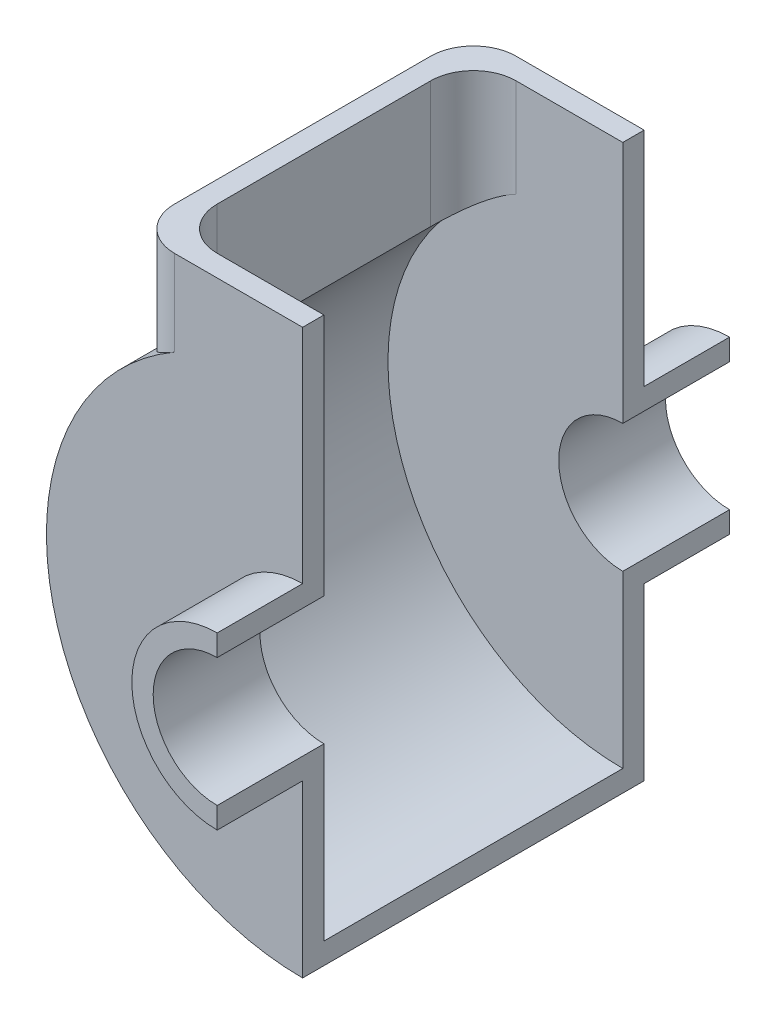
ISO-10303-21;
HEADER;
FILE_DESCRIPTION(('STEP AP214'),'2;1');
FILE_NAME('part.step','',(''),(''),'','','');
FILE_SCHEMA(('AUTOMOTIVE_DESIGN { 1 0 10303 214 1 1 1 1 }'));
ENDSEC;
DATA;
#1=APPLICATION_CONTEXT('core data for automotive mechanical design processes');
#2=APPLICATION_PROTOCOL_DEFINITION('international standard','automotive_design',2000,#1);
#3=PRODUCT_CONTEXT('',#1,'mechanical');
#4=PRODUCT('Part','Part','',(#3));
#5=PRODUCT_RELATED_PRODUCT_CATEGORY('part','',(#4));
#6=PRODUCT_DEFINITION_FORMATION('','',#4);
#7=PRODUCT_DEFINITION_CONTEXT('part definition',#1,'design');
#8=PRODUCT_DEFINITION('design','',#6,#7);
#9=PRODUCT_DEFINITION_SHAPE('','',#8);
#10=(LENGTH_UNIT() NAMED_UNIT(*) SI_UNIT(.MILLI.,.METRE.));
#11=(NAMED_UNIT(*) PLANE_ANGLE_UNIT() SI_UNIT($,.RADIAN.));
#12=(NAMED_UNIT(*) SI_UNIT($,.STERADIAN.) SOLID_ANGLE_UNIT());
#13=UNCERTAINTY_MEASURE_WITH_UNIT(LENGTH_MEASURE(1.E-05),#10,'distance_accuracy_value','');
#14=(GEOMETRIC_REPRESENTATION_CONTEXT(3) GLOBAL_UNCERTAINTY_ASSIGNED_CONTEXT((#13)) GLOBAL_UNIT_ASSIGNED_CONTEXT((#10,
#11,#12)) REPRESENTATION_CONTEXT('',''));
#15=CARTESIAN_POINT('',(0.,0.,0.));
#16=DIRECTION('',(0.,0.,1.));
#17=DIRECTION('',(1.,0.,0.));
#18=AXIS2_PLACEMENT_3D('',#15,#16,#17);
#19=CARTESIAN_POINT('',(0.,0.,25.));
#20=DIRECTION('',(0.,0.,-1.));
#21=DIRECTION('',(-1.,0.,0.));
#22=AXIS2_PLACEMENT_3D('',#19,#20,#21);
#23=CYLINDRICAL_SURFACE('',#22,20.);
#24=CARTESIAN_POINT('',(0.,0.,5.));
#25=DIRECTION('',(0.,0.,-1.));
#26=DIRECTION('',(-1.,0.,0.));
#27=AXIS2_PLACEMENT_3D('',#24,#25,#26);
#28=CIRCLE('',#27,20.);
#29=CARTESIAN_POINT('',(0.,-20.,5.));
#30=VERTEX_POINT('',#29);
#31=CARTESIAN_POINT('',(0.,20.,5.));
#32=VERTEX_POINT('',#31);
#33=EDGE_CURVE('E246',#30,#32,#28,.T.);
#34=ORIENTED_EDGE('',*,*,#33,.F.);
#35=DIRECTION('',(0.,0.,-1.));
#36=VECTOR('',#35,1.);
#37=CARTESIAN_POINT('',(0.,-20.,25.));
#38=LINE('',#37,#36);
#39=CARTESIAN_POINT('',(0.,-20.,25.));
#40=VERTEX_POINT('',#39);
#41=EDGE_CURVE('E291',#40,#30,#38,.T.);
#42=ORIENTED_EDGE('',*,*,#41,.F.);
#43=CARTESIAN_POINT('',(0.,0.,25.));
#44=DIRECTION('',(0.,0.,1.));
#45=DIRECTION('',(1.,0.,0.));
#46=AXIS2_PLACEMENT_3D('',#43,#44,#45);
#47=CIRCLE('',#46,20.);
#48=CARTESIAN_POINT('',(0.,20.,25.));
#49=VERTEX_POINT('',#48);
#50=EDGE_CURVE('E279',#49,#40,#47,.T.);
#51=ORIENTED_EDGE('',*,*,#50,.F.);
#52=DIRECTION('',(0.,0.,-1.));
#53=VECTOR('',#52,1.);
#54=CARTESIAN_POINT('',(0.,20.,25.));
#55=LINE('',#54,#53);
#56=EDGE_CURVE('E294',#49,#32,#55,.T.);
#57=ORIENTED_EDGE('',*,*,#56,.T.);
#58=EDGE_LOOP('',(#34,#42,#51,#57));
#59=FACE_BOUND('',#58,.T.);
#60=ADVANCED_FACE('F33',(#59),#23,.T.);
#61=CARTESIAN_POINT('',(0.,0.,25.));
#62=DIRECTION('',(0.,0.,-1.));
#63=DIRECTION('',(-1.,0.,0.));
#64=AXIS2_PLACEMENT_3D('',#61,#62,#63);
#65=CYLINDRICAL_SURFACE('',#64,15.);
#66=CARTESIAN_POINT('',(0.,0.,0.));
#67=DIRECTION('',(0.,0.,-1.));
#68=DIRECTION('',(-1.,0.,0.));
#69=AXIS2_PLACEMENT_3D('',#66,#67,#68);
#70=CIRCLE('',#69,15.);
#71=CARTESIAN_POINT('',(0.,-15.,0.));
#72=VERTEX_POINT('',#71);
#73=CARTESIAN_POINT('',(0.,15.,0.));
#74=VERTEX_POINT('',#73);
#75=EDGE_CURVE('E272',#72,#74,#70,.T.);
#76=ORIENTED_EDGE('',*,*,#75,.T.);
#77=DIRECTION('',(0.,0.,-1.));
#78=VECTOR('',#77,1.);
#79=CARTESIAN_POINT('',(0.,15.,25.));
#80=LINE('',#79,#78);
#81=CARTESIAN_POINT('',(0.,15.,25.));
#82=VERTEX_POINT('',#81);
#83=EDGE_CURVE('E296',#82,#74,#80,.T.);
#84=ORIENTED_EDGE('',*,*,#83,.F.);
#85=CARTESIAN_POINT('',(0.,0.,25.));
#86=DIRECTION('',(0.,0.,-1.));
#87=DIRECTION('',(-1.,0.,0.));
#88=AXIS2_PLACEMENT_3D('',#85,#86,#87);
#89=CIRCLE('',#88,15.);
#90=CARTESIAN_POINT('',(0.,-15.,25.));
#91=VERTEX_POINT('',#90);
#92=EDGE_CURVE('E273',#91,#82,#89,.T.);
#93=ORIENTED_EDGE('',*,*,#92,.F.);
#94=DIRECTION('',(0.,0.,-1.));
#95=VECTOR('',#94,1.);
#96=CARTESIAN_POINT('',(0.,-15.,25.));
#97=LINE('',#96,#95);
#98=EDGE_CURVE('E283',#91,#72,#97,.T.);
#99=ORIENTED_EDGE('',*,*,#98,.T.);
#100=EDGE_LOOP('',(#76,#84,#93,#99));
#101=FACE_BOUND('',#100,.T.);
#102=ADVANCED_FACE('F338',(#101),#65,.F.);
#103=CARTESIAN_POINT('',(0.,15.,25.));
#104=DIRECTION('',(-1.,0.,0.));
#105=DIRECTION('',(0.,0.,1.));
#106=AXIS2_PLACEMENT_3D('',#103,#104,#105);
#107=PLANE('',#106);
#108=DIRECTION('',(0.,1.,0.));
#109=VECTOR('',#108,1.);
#110=CARTESIAN_POINT('',(0.,15.,0.));
#111=LINE('',#110,#109);
#112=CARTESIAN_POINT('',(0.,72.,0.));
#113=VERTEX_POINT('',#112);
#114=EDGE_CURVE('E286',#74,#113,#111,.T.);
#115=ORIENTED_EDGE('',*,*,#114,.T.);
#116=DIRECTION('',(0.,0.,-1.));
#117=VECTOR('',#116,1.);
#118=CARTESIAN_POINT('',(0.,72.,5.));
#119=LINE('',#118,#117);
#120=CARTESIAN_POINT('',(0.,72.,5.));
#121=VERTEX_POINT('',#120);
#122=EDGE_CURVE('E269',#121,#113,#119,.T.);
#123=ORIENTED_EDGE('',*,*,#122,.F.);
#124=DIRECTION('',(0.,1.,0.));
#125=VECTOR('',#124,1.);
#126=CARTESIAN_POINT('',(0.,20.,5.));
#127=LINE('',#126,#125);
#128=EDGE_CURVE('E249',#32,#121,#127,.T.);
#129=ORIENTED_EDGE('',*,*,#128,.F.);
#130=ORIENTED_EDGE('',*,*,#56,.F.);
#131=DIRECTION('',(0.,1.,0.));
#132=VECTOR('',#131,1.);
#133=CARTESIAN_POINT('',(0.,15.,25.));
#134=LINE('',#133,#132);
#135=EDGE_CURVE('E276',#82,#49,#134,.T.);
#136=ORIENTED_EDGE('',*,*,#135,.F.);
#137=ORIENTED_EDGE('',*,*,#83,.T.);
#138=EDGE_LOOP('',(#115,#123,#129,#130,#136,#137));
#139=FACE_BOUND('',#138,.T.);
#140=ADVANCED_FACE('F383',(#139),#107,.F.);
#141=CARTESIAN_POINT('',(0.,-20.,25.));
#142=DIRECTION('',(-1.,0.,0.));
#143=DIRECTION('',(0.,0.,1.));
#144=AXIS2_PLACEMENT_3D('',#141,#142,#143);
#145=PLANE('',#144);
#146=DIRECTION('',(0.,0.,-1.));
#147=VECTOR('',#146,1.);
#148=CARTESIAN_POINT('',(0.,-60.,5.));
#149=LINE('',#148,#147);
#150=CARTESIAN_POINT('',(0.,-60.,5.));
#151=VERTEX_POINT('',#150);
#152=CARTESIAN_POINT('',(0.,-60.,-75.));
#153=VERTEX_POINT('',#152);
#154=EDGE_CURVE('E259',#151,#153,#149,.T.);
#155=ORIENTED_EDGE('',*,*,#154,.T.);
#156=DIRECTION('',(0.,1.,0.));
#157=VECTOR('',#156,1.);
#158=CARTESIAN_POINT('',(0.,-60.,-75.));
#159=LINE('',#158,#157);
#160=CARTESIAN_POINT('',(0.,-20.,-75.));
#161=VERTEX_POINT('',#160);
#162=EDGE_CURVE('E192',#153,#161,#159,.T.);
#163=ORIENTED_EDGE('',*,*,#162,.T.);
#164=DIRECTION('',(0.,0.,1.));
#165=VECTOR('',#164,1.);
#166=CARTESIAN_POINT('',(0.,-20.,-95.));
#167=LINE('',#166,#165);
#168=CARTESIAN_POINT('',(0.,-20.,-95.));
#169=VERTEX_POINT('',#168);
#170=EDGE_CURVE('E225',#169,#161,#167,.T.);
#171=ORIENTED_EDGE('',*,*,#170,.F.);
#172=DIRECTION('',(0.,1.,0.));
#173=VECTOR('',#172,1.);
#174=CARTESIAN_POINT('',(0.,-20.,-95.));
#175=LINE('',#174,#173);
#176=CARTESIAN_POINT('',(0.,-15.,-95.));
#177=VERTEX_POINT('',#176);
#178=EDGE_CURVE('E215',#169,#177,#175,.T.);
#179=ORIENTED_EDGE('',*,*,#178,.T.);
#180=DIRECTION('',(0.,0.,1.));
#181=VECTOR('',#180,1.);
#182=CARTESIAN_POINT('',(0.,-15.,-95.));
#183=LINE('',#182,#181);
#184=CARTESIAN_POINT('',(0.,-15.,-70.));
#185=VERTEX_POINT('',#184);
#186=EDGE_CURVE('E217',#177,#185,#183,.T.);
#187=ORIENTED_EDGE('',*,*,#186,.T.);
#188=DIRECTION('',(0.,1.,0.));
#189=VECTOR('',#188,1.);
#190=CARTESIAN_POINT('',(0.,-20.,-70.));
#191=LINE('',#190,#189);
#192=CARTESIAN_POINT('',(0.,-55.,-70.));
#193=VERTEX_POINT('',#192);
#194=EDGE_CURVE('E210',#193,#185,#191,.T.);
#195=ORIENTED_EDGE('',*,*,#194,.F.);
#196=DIRECTION('',(0.,0.,1.));
#197=VECTOR('',#196,1.);
#198=CARTESIAN_POINT('',(0.,-55.,-95.002));
#199=LINE('',#198,#197);
#200=CARTESIAN_POINT('',(0.,-55.,0.));
#201=VERTEX_POINT('',#200);
#202=EDGE_CURVE('E239',#193,#201,#199,.T.);
#203=ORIENTED_EDGE('',*,*,#202,.T.);
#204=DIRECTION('',(0.,1.,0.));
#205=VECTOR('',#204,1.);
#206=CARTESIAN_POINT('',(0.,-20.,0.));
#207=LINE('',#206,#205);
#208=EDGE_CURVE('E277',#201,#72,#207,.T.);
#209=ORIENTED_EDGE('',*,*,#208,.T.);
#210=ORIENTED_EDGE('',*,*,#98,.F.);
#211=DIRECTION('',(0.,1.,0.));
#212=VECTOR('',#211,1.);
#213=CARTESIAN_POINT('',(0.,-20.,25.));
#214=LINE('',#213,#212);
#215=EDGE_CURVE('E281',#40,#91,#214,.T.);
#216=ORIENTED_EDGE('',*,*,#215,.F.);
#217=ORIENTED_EDGE('',*,*,#41,.T.);
#218=DIRECTION('',(0.,1.,0.));
#219=VECTOR('',#218,1.);
#220=CARTESIAN_POINT('',(0.,-60.,5.));
#221=LINE('',#220,#219);
#222=EDGE_CURVE('E256',#151,#30,#221,.T.);
#223=ORIENTED_EDGE('',*,*,#222,.F.);
#224=EDGE_LOOP('',(#155,#163,#171,#179,#187,#195,#203,#209,#210,#216,#217,#223));
#225=FACE_BOUND('',#224,.T.);
#226=ADVANCED_FACE('F386',(#225),#145,.F.);
#227=CARTESIAN_POINT('',(0.,0.,25.));
#228=DIRECTION('',(0.,0.,-1.));
#229=DIRECTION('',(-1.,0.,0.));
#230=AXIS2_PLACEMENT_3D('',#227,#228,#229);
#231=PLANE('',#230);
#232=ORIENTED_EDGE('',*,*,#92,.T.);
#233=ORIENTED_EDGE('',*,*,#135,.T.);
#234=ORIENTED_EDGE('',*,*,#50,.T.);
#235=ORIENTED_EDGE('',*,*,#215,.T.);
#236=EDGE_LOOP('',(#232,#233,#234,#235));
#237=FACE_BOUND('',#236,.T.);
#238=ADVANCED_FACE('F393',(#237),#231,.F.);
#239=CARTESIAN_POINT('',(0.,0.,0.));
#240=DIRECTION('',(0.,0.,-1.));
#241=DIRECTION('',(-1.,0.,0.));
#242=AXIS2_PLACEMENT_3D('',#239,#240,#241);
#243=PLANE('',#242);
#244=CARTESIAN_POINT('',(0.,0.,0.));
#245=DIRECTION('',(0.,0.,-1.));
#246=DIRECTION('',(-1.,0.,0.));
#247=AXIS2_PLACEMENT_3D('',#244,#245,#246);
#248=CIRCLE('',#247,55.);
#249=CARTESIAN_POINT('',(-25.,48.9897948556636,0.));
#250=VERTEX_POINT('',#249);
#251=EDGE_CURVE('E232',#250,#201,#248,.F.);
#252=ORIENTED_EDGE('',*,*,#251,.F.);
#253=DIRECTION('',(0.,-1.,0.));
#254=VECTOR('',#253,1.);
#255=CARTESIAN_POINT('',(-25.,0.,0.));
#256=LINE('',#255,#254);
#257=CARTESIAN_POINT('',(-25.,72.,0.));
#258=VERTEX_POINT('',#257);
#259=EDGE_CURVE('E405',#250,#258,#256,.F.);
#260=ORIENTED_EDGE('',*,*,#259,.T.);
#261=DIRECTION('',(-1.,0.,0.));
#262=VECTOR('',#261,1.);
#263=CARTESIAN_POINT('',(0.,72.,0.));
#264=LINE('',#263,#262);
#265=EDGE_CURVE('E245',#113,#258,#264,.T.);
#266=ORIENTED_EDGE('',*,*,#265,.F.);
#267=ORIENTED_EDGE('',*,*,#114,.F.);
#268=ORIENTED_EDGE('',*,*,#75,.F.);
#269=ORIENTED_EDGE('',*,*,#208,.F.);
#270=EDGE_LOOP('',(#252,#260,#266,#267,#268,#269));
#271=FACE_BOUND('',#270,.T.);
#272=ADVANCED_FACE('F403',(#271),#243,.T.);
#273=CARTESIAN_POINT('',(0.,72.,5.));
#274=DIRECTION('',(0.,-1.,0.));
#275=DIRECTION('',(0.,0.,-1.));
#276=AXIS2_PLACEMENT_3D('',#273,#274,#275);
#277=PLANE('',#276);
#278=DIRECTION('',(-1.,0.,0.));
#279=VECTOR('',#278,1.);
#280=CARTESIAN_POINT('',(0.,72.,-75.));
#281=LINE('',#280,#279);
#282=CARTESIAN_POINT('',(0.,72.,-75.));
#283=VERTEX_POINT('',#282);
#284=CARTESIAN_POINT('',(-30.,72.,-75.));
#285=VERTEX_POINT('',#284);
#286=EDGE_CURVE('E173',#283,#285,#281,.T.);
#287=ORIENTED_EDGE('',*,*,#286,.T.);
#288=CARTESIAN_POINT('',(-30.,72.,-65.));
#289=DIRECTION('',(0.,-1.,0.));
#290=DIRECTION('',(0.,0.,-1.));
#291=AXIS2_PLACEMENT_3D('',#288,#289,#290);
#292=CIRCLE('',#291,10.);
#293=CARTESIAN_POINT('',(-40.,72.,-65.));
#294=VERTEX_POINT('',#293);
#295=EDGE_CURVE('E307',#285,#294,#292,.F.);
#296=ORIENTED_EDGE('',*,*,#295,.T.);
#297=DIRECTION('',(0.,0.,-1.));
#298=VECTOR('',#297,1.);
#299=CARTESIAN_POINT('',(-40.,72.,5.));
#300=LINE('',#299,#298);
#301=CARTESIAN_POINT('',(-40.,72.,-5.));
#302=VERTEX_POINT('',#301);
#303=EDGE_CURVE('E266',#302,#294,#300,.T.);
#304=ORIENTED_EDGE('',*,*,#303,.F.);
#305=CARTESIAN_POINT('',(-30.,72.,-5.));
#306=DIRECTION('',(0.,-1.,0.));
#307=DIRECTION('',(0.,0.,-1.));
#308=AXIS2_PLACEMENT_3D('',#305,#306,#307);
#309=CIRCLE('',#308,10.);
#310=CARTESIAN_POINT('',(-30.,72.,5.));
#311=VERTEX_POINT('',#310);
#312=EDGE_CURVE('E305',#302,#311,#309,.F.);
#313=ORIENTED_EDGE('',*,*,#312,.T.);
#314=DIRECTION('',(-1.,0.,0.));
#315=VECTOR('',#314,1.);
#316=CARTESIAN_POINT('',(0.,72.,5.));
#317=LINE('',#316,#315);
#318=EDGE_CURVE('E251',#121,#311,#317,.T.);
#319=ORIENTED_EDGE('',*,*,#318,.F.);
#320=ORIENTED_EDGE('',*,*,#122,.T.);
#321=ORIENTED_EDGE('',*,*,#265,.T.);
#322=CARTESIAN_POINT('',(-25.,72.,-9.99999999999999));
#323=DIRECTION('',(0.,-1.,0.));
#324=DIRECTION('',(0.,0.,-1.));
#325=AXIS2_PLACEMENT_3D('',#322,#323,#324);
#326=CIRCLE('',#325,10.);
#327=CARTESIAN_POINT('',(-35.,72.,-9.99999999999999));
#328=VERTEX_POINT('',#327);
#329=EDGE_CURVE('E356',#258,#328,#326,.T.);
#330=ORIENTED_EDGE('',*,*,#329,.T.);
#331=DIRECTION('',(0.,0.,1.));
#332=VECTOR('',#331,1.);
#333=CARTESIAN_POINT('',(-35.,72.,-95.002));
#334=LINE('',#333,#332);
#335=CARTESIAN_POINT('',(-35.,72.,-60.));
#336=VERTEX_POINT('',#335);
#337=EDGE_CURVE('E238',#336,#328,#334,.T.);
#338=ORIENTED_EDGE('',*,*,#337,.F.);
#339=CARTESIAN_POINT('',(-25.,72.,-60.));
#340=DIRECTION('',(0.,-1.,0.));
#341=DIRECTION('',(0.,0.,-1.));
#342=AXIS2_PLACEMENT_3D('',#339,#340,#341);
#343=CIRCLE('',#342,10.);
#344=CARTESIAN_POINT('',(-25.,72.,-70.));
#345=VERTEX_POINT('',#344);
#346=EDGE_CURVE('E47',#336,#345,#343,.T.);
#347=ORIENTED_EDGE('',*,*,#346,.T.);
#348=DIRECTION('',(-1.,0.,0.));
#349=VECTOR('',#348,1.);
#350=CARTESIAN_POINT('',(0.,72.,-70.));
#351=LINE('',#350,#349);
#352=CARTESIAN_POINT('',(0.,72.,-70.));
#353=VERTEX_POINT('',#352);
#354=EDGE_CURVE('E188',#353,#345,#351,.T.);
#355=ORIENTED_EDGE('',*,*,#354,.F.);
#356=DIRECTION('',(0.,0.,1.));
#357=VECTOR('',#356,1.);
#358=CARTESIAN_POINT('',(0.,72.,-75.));
#359=LINE('',#358,#357);
#360=EDGE_CURVE('E186',#283,#353,#359,.T.);
#361=ORIENTED_EDGE('',*,*,#360,.F.);
#362=EDGE_LOOP('',(#287,#296,#304,#313,#319,#320,#321,#330,#338,#347,#355,#361));
#363=FACE_BOUND('',#362,.T.);
#364=ADVANCED_FACE('F187',(#363),#277,.F.);
#365=CARTESIAN_POINT('',(-40.,72.,5.));
#366=DIRECTION('',(1.,0.,0.));
#367=DIRECTION('',(0.,1.,0.));
#368=AXIS2_PLACEMENT_3D('',#365,#366,#367);
#369=PLANE('',#368);
#370=ORIENTED_EDGE('',*,*,#303,.T.);
#371=DIRECTION('',(0.,-1.,0.));
#372=VECTOR('',#371,1.);
#373=CARTESIAN_POINT('',(-40.,72.,-65.));
#374=LINE('',#373,#372);
#375=CARTESIAN_POINT('',(-40.,44.7213595499958,-65.));
#376=VERTEX_POINT('',#375);
#377=EDGE_CURVE('E301',#294,#376,#374,.T.);
#378=ORIENTED_EDGE('',*,*,#377,.T.);
#379=DIRECTION('',(0.,0.,-1.));
#380=VECTOR('',#379,1.);
#381=CARTESIAN_POINT('',(-40.,44.7213595499958,5.));
#382=LINE('',#381,#380);
#383=CARTESIAN_POINT('',(-40.,44.7213595499958,-5.));
#384=VERTEX_POINT('',#383);
#385=EDGE_CURVE('E263',#384,#376,#382,.T.);
#386=ORIENTED_EDGE('',*,*,#385,.F.);
#387=DIRECTION('',(0.,-1.,0.));
#388=VECTOR('',#387,1.);
#389=CARTESIAN_POINT('',(-40.,72.,-5.));
#390=LINE('',#389,#388);
#391=EDGE_CURVE('E299',#384,#302,#390,.F.);
#392=ORIENTED_EDGE('',*,*,#391,.T.);
#393=EDGE_LOOP('',(#370,#378,#386,#392));
#394=FACE_BOUND('',#393,.T.);
#395=ADVANCED_FACE('F373',(#394),#369,.F.);
#396=CARTESIAN_POINT('',(0.,0.,5.));
#397=DIRECTION('',(0.,0.,-1.));
#398=DIRECTION('',(-1.,0.,0.));
#399=AXIS2_PLACEMENT_3D('',#396,#397,#398);
#400=CYLINDRICAL_SURFACE('',#399,60.);
#401=CARTESIAN_POINT('',(0.,0.,5.));
#402=DIRECTION('',(0.,0.,1.));
#403=DIRECTION('',(1.,0.,0.));
#404=AXIS2_PLACEMENT_3D('',#401,#402,#403);
#405=CIRCLE('',#404,60.);
#406=CARTESIAN_POINT('',(-30.,51.9615242270663,5.));
#407=VERTEX_POINT('',#406);
#408=EDGE_CURVE('E254',#407,#151,#405,.T.);
#409=ORIENTED_EDGE('',*,*,#408,.F.);
#410=CARTESIAN_POINT('',(-30.,51.9615242270663,5.));
#411=CARTESIAN_POINT('',(-30.1846403402756,51.8549243575684,4.99999694467445));
#412=CARTESIAN_POINT('',(-30.3686755821332,51.7473565843307,4.99488587812623));
#413=CARTESIAN_POINT('',(-30.7351668388072,51.5305231450817,4.97462918627216));
#414=CARTESIAN_POINT('',(-30.9176229894396,51.4212576273974,4.95948443281986));
#415=CARTESIAN_POINT('',(-31.4619253243051,51.0913595980358,4.89929167200636));
#416=CARTESIAN_POINT('',(-31.8209014856786,50.868512343648,4.83948477245505));
#417=CARTESIAN_POINT('',(-32.5288887310146,50.418725257113,4.6817684192746));
#418=CARTESIAN_POINT('',(-32.8778736192083,50.1917768316844,4.5837671788936));
#419=CARTESIAN_POINT('',(-33.562476910193,49.7365966241752,4.35090696893926));
#420=CARTESIAN_POINT('',(-33.8980954977704,49.5083648598861,4.21604850911225));
#421=CARTESIAN_POINT('',(-34.5207296024579,49.0759439346811,3.92574534472068));
#422=CARTESIAN_POINT('',(-34.8092512536601,48.8716304811259,3.77370267176126));
#423=CARTESIAN_POINT('',(-35.3716903107987,48.4661085573826,3.44107089228342));
#424=CARTESIAN_POINT('',(-35.6456079007732,48.2649000480893,3.26048214561176));
#425=CARTESIAN_POINT('',(-36.1765727574088,47.8682074936152,2.87135112309205));
#426=CARTESIAN_POINT('',(-36.4336405194033,47.6727166603459,2.66284378257166));
#427=CARTESIAN_POINT('',(-36.9290721152615,47.289972828363,2.21794621899144));
#428=CARTESIAN_POINT('',(-37.167441451851,47.1027174132442,1.98156425075618));
#429=CARTESIAN_POINT('',(-37.565018182153,46.785859634165,1.54478146403291));
#430=CARTESIAN_POINT('',(-37.7289458526818,46.6537017113221,1.35050833176436));
#431=CARTESIAN_POINT('',(-38.043765038696,46.397339573439,0.94671050583668));
#432=CARTESIAN_POINT('',(-38.1946575996422,46.2731347207424,0.737187037795441));
#433=CARTESIAN_POINT('',(-38.4818360085844,46.0345861261904,0.303399948510731));
#434=CARTESIAN_POINT('',(-38.618136880254,45.9202322658759,0.0791518792914258));
#435=CARTESIAN_POINT('',(-38.8746918035924,45.7032445431668,-0.383743447816976));
#436=CARTESIAN_POINT('',(-38.9949492411763,45.6006082084878,-0.622387651960071));
#437=CARTESIAN_POINT('',(-39.1965662504922,45.4273417305266,-1.06669402634215));
#438=CARTESIAN_POINT('',(-39.2809795718103,45.3543309967536,-1.27004581930022));
#439=CARTESIAN_POINT('',(-39.437114382813,45.2186323209963,-1.68488791321455));
#440=CARTESIAN_POINT('',(-39.508838494378,45.1559422467147,-1.89637652189832));
#441=CARTESIAN_POINT('',(-39.6385128100447,45.0421551914612,-2.32617263610177));
#442=CARTESIAN_POINT('',(-39.6964869139818,44.9910381018204,-2.54446755239789));
#443=CARTESIAN_POINT('',(-39.7978943535571,44.9013606141582,-2.986852666006));
#444=CARTESIAN_POINT('',(-39.8413328734582,44.8627957393971,-3.2109407663361));
#445=CARTESIAN_POINT('',(-39.9177189665931,44.7948514731765,-3.69377442824111));
#446=CARTESIAN_POINT('',(-39.9484884415043,44.7673886419263,-3.95314914513775));
#447=CARTESIAN_POINT('',(-39.9793476433001,44.7398248250479,-4.34440444684136));
#448=CARTESIAN_POINT('',(-39.987084921451,44.7329085695169,-4.47527578752074));
#449=CARTESIAN_POINT('',(-39.9974129661721,44.7236736235071,-4.73742237599204));
#450=CARTESIAN_POINT('',(-40.0000021863485,44.7213563144782,-4.86869773328783));
#451=CARTESIAN_POINT('',(-40.,44.7213595499958,-5.));
#452=B_SPLINE_CURVE_WITH_KNOTS('',3,(#410,#411,#412,#413,#414,#415,#416,#417,#418,#419,#420,
#421,#422,#423,#424,#425,#426,#427,#428,#429,#430,#431,#432,#433,#434,#435,#436,#437,#438,#439,
#440,#441,#442,#443,#444,#445,#446,#447,#448,#449,#450,#451),.UNSPECIFIED.,.F.,.F.,(4,2,2,2,2,2,
2,2,2,2,2,2,2,2,2,2,2,2,2,2,4),(0.,0.639469988122809,1.27888441829631,2.55703672344089,
3.8382797512943,5.11950506007104,6.27274736359203,7.42597513070353,8.5777730871098,
9.72923080131075,10.5879927572485,11.4466857734357,12.3044859953459,13.1621048939207,
13.8573439066469,14.5524390989254,15.2463170957639,15.9399473495784,16.7262834977137,
17.1199731890566,17.5137811205932),.UNSPECIFIED.);
#453=EDGE_CURVE('E321',#407,#384,#452,.T.);
#454=ORIENTED_EDGE('',*,*,#453,.T.);
#455=ORIENTED_EDGE('',*,*,#385,.T.);
#456=CARTESIAN_POINT('',(-40.,44.7213595499958,-65.));
#457=CARTESIAN_POINT('',(-40.0000015812733,44.7213573011344,-65.1176634010021));
#458=CARTESIAN_POINT('',(-39.9979227141808,44.7232176305845,-65.2353086549857));
#459=CARTESIAN_POINT('',(-39.9896253110866,44.7306372942271,-65.4703286016599));
#460=CARTESIAN_POINT('',(-39.9834070494192,44.7361963832882,-65.5877033117632));
#461=CARTESIAN_POINT('',(-39.9585923280535,44.7583670958171,-65.9388427467586));
#462=CARTESIAN_POINT('',(-39.9338358355778,44.7804722797486,-66.1718758054602));
#463=CARTESIAN_POINT('',(-39.8686644525486,44.8385042167555,-66.6318691326489));
#464=CARTESIAN_POINT('',(-39.8283855148164,44.8743109465834,-66.8588643223737));
#465=CARTESIAN_POINT('',(-39.7328892662281,44.9588875680342,-67.3072524479117));
#466=CARTESIAN_POINT('',(-39.6776696039361,45.0076595001554,-67.5286444958756));
#467=CARTESIAN_POINT('',(-39.5534118644793,45.1168972505339,-67.9636688649734));
#468=CARTESIAN_POINT('',(-39.4844211995899,45.1773229225701,-68.1773249178853));
#469=CARTESIAN_POINT('',(-39.3334605195833,45.3088170177995,-68.5966936542645));
#470=CARTESIAN_POINT('',(-39.2514857085459,45.3798893730022,-68.8024033675523));
#471=CARTESIAN_POINT('',(-39.0753863002099,45.5316122169457,-69.2054529377369));
#472=CARTESIAN_POINT('',(-38.9812363061758,45.6122826978885,-69.4027741200324));
#473=CARTESIAN_POINT('',(-38.7818943790383,45.7818938454653,-69.788046749896));
#474=CARTESIAN_POINT('',(-38.6767013504078,45.8708353325264,-69.9759972651116));
#475=CARTESIAN_POINT('',(-38.4135728743112,46.0916172160901,-70.4129070483267));
#476=CARTESIAN_POINT('',(-38.2509572804995,46.2267600621542,-70.6573967975821));
#477=CARTESIAN_POINT('',(-37.908447036405,46.5080507377658,-71.1270697633622));
#478=CARTESIAN_POINT('',(-37.7285517130429,46.6541989959475,-71.3522522271834));
#479=CARTESIAN_POINT('',(-37.3531054007839,46.9553345195759,-71.783333742699));
#480=CARTESIAN_POINT('',(-37.1575367002328,47.1103317262239,-71.9892103913973));
#481=CARTESIAN_POINT('',(-36.7525951751676,47.4269223387039,-72.3811838692743));
#482=CARTESIAN_POINT('',(-36.5432234671629,47.5885152106185,-72.5672822951176));
#483=CARTESIAN_POINT('',(-35.889352420626,48.0859277319981,-73.1015951815724));
#484=CARTESIAN_POINT('',(-35.4251261289153,48.429498559668,-73.4189829871174));
#485=CARTESIAN_POINT('',(-34.4553726874119,49.1241578823887,-73.9699716496598));
#486=CARTESIAN_POINT('',(-33.9498747171002,49.4752409388269,-74.2036310842669));
#487=CARTESIAN_POINT('',(-33.1568278633415,50.0073212539565,-74.4930456878643));
#488=CARTESIAN_POINT('',(-32.8810021018505,50.1891501210001,-74.5803819665683));
#489=CARTESIAN_POINT('',(-32.3217375725054,50.5511235483305,-74.7310524671282));
#490=CARTESIAN_POINT('',(-32.0382991780871,50.7312681906542,-74.7943878640466));
#491=CARTESIAN_POINT('',(-31.4650006560554,51.0888227050653,-74.8963939978526));
#492=CARTESIAN_POINT('',(-31.1751356203563,51.2662302982853,-74.935045161166));
#493=CARTESIAN_POINT('',(-30.5906934832528,51.6171131325133,-74.9868485137105));
#494=CARTESIAN_POINT('',(-30.2961152167169,51.7905873747387,-74.9999942965489));
#495=CARTESIAN_POINT('',(-30.,51.9615242270663,-75.));
#496=B_SPLINE_CURVE_WITH_KNOTS('',3,(#456,#457,#458,#459,#460,#461,#462,#463,#464,#465,#466,
#467,#468,#469,#470,#471,#472,#473,#474,#475,#476,#477,#478,#479,#480,#481,#482,#483,#484,#485,
#486,#487,#488,#489,#490,#491,#492,#493,#494,#495),.UNSPECIFIED.,.F.,.F.,(4,2,2,2,2,2,2,2,2,2,2,
2,2,2,2,2,2,2,2,4),(0.,0.352921378883185,0.705819370583158,1.41085932128629,2.10985961734753,
2.80896998914977,3.50571366437716,4.20271529673452,4.90119502233958,5.59974410640154,
6.5680578816333,7.536409389878,8.50587104319846,9.47525437387455,11.4447404103531,
13.4128458625583,14.4372042618812,15.4615125030147,16.4866319729198,17.5120088970541),.UNSPECIFIED.);
#497=CARTESIAN_POINT('',(-30.,51.9615242270663,-75.));
#498=VERTEX_POINT('',#497);
#499=EDGE_CURVE('E312',#376,#498,#496,.T.);
#500=ORIENTED_EDGE('',*,*,#499,.T.);
#501=CARTESIAN_POINT('',(0.,0.,-75.));
#502=DIRECTION('',(0.,0.,1.));
#503=DIRECTION('',(1.,0.,0.));
#504=AXIS2_PLACEMENT_3D('',#501,#502,#503);
#505=CIRCLE('',#504,60.);
#506=EDGE_CURVE('E183',#498,#153,#505,.T.);
#507=ORIENTED_EDGE('',*,*,#506,.T.);
#508=ORIENTED_EDGE('',*,*,#154,.F.);
#509=EDGE_LOOP('',(#409,#454,#455,#500,#507,#508));
#510=FACE_BOUND('',#509,.T.);
#511=ADVANCED_FACE('F328',(#510),#400,.T.);
#512=CARTESIAN_POINT('',(0.,0.,5.));
#513=DIRECTION('',(0.,0.,-1.));
#514=DIRECTION('',(-1.,0.,0.));
#515=AXIS2_PLACEMENT_3D('',#512,#513,#514);
#516=PLANE('',#515);
#517=ORIENTED_EDGE('',*,*,#318,.T.);
#518=DIRECTION('',(0.,-1.,0.));
#519=VECTOR('',#518,1.);
#520=CARTESIAN_POINT('',(-30.,0.,5.));
#521=LINE('',#520,#519);
#522=EDGE_CURVE('E309',#311,#407,#521,.T.);
#523=ORIENTED_EDGE('',*,*,#522,.T.);
#524=ORIENTED_EDGE('',*,*,#408,.T.);
#525=ORIENTED_EDGE('',*,*,#222,.T.);
#526=ORIENTED_EDGE('',*,*,#33,.T.);
#527=ORIENTED_EDGE('',*,*,#128,.T.);
#528=EDGE_LOOP('',(#517,#523,#524,#525,#526,#527));
#529=FACE_BOUND('',#528,.T.);
#530=ADVANCED_FACE('F364',(#529),#516,.F.);
#531=CARTESIAN_POINT('',(0.,0.,-95.002));
#532=DIRECTION('',(0.,0.,1.));
#533=DIRECTION('',(1.,0.,0.));
#534=AXIS2_PLACEMENT_3D('',#531,#532,#533);
#535=CYLINDRICAL_SURFACE('',#534,55.);
#536=ORIENTED_EDGE('',*,*,#202,.F.);
#537=CARTESIAN_POINT('',(0.,0.,-70.));
#538=DIRECTION('',(0.,0.,1.));
#539=DIRECTION('',(1.,0.,0.));
#540=AXIS2_PLACEMENT_3D('',#537,#538,#539);
#541=CIRCLE('',#540,55.);
#542=CARTESIAN_POINT('',(-25.,48.9897948556636,-70.));
#543=VERTEX_POINT('',#542);
#544=EDGE_CURVE('E53',#193,#543,#541,.F.);
#545=ORIENTED_EDGE('',*,*,#544,.T.);
#546=CARTESIAN_POINT('',(-25.,48.9897948556636,-70.));
#547=CARTESIAN_POINT('',(-25.1906704625853,48.8924964907343,-69.9999971656189));
#548=CARTESIAN_POINT('',(-25.3807299051036,48.7941008127997,-69.994546206801));
#549=CARTESIAN_POINT('',(-25.7591946792121,48.5953653194177,-69.9729416657178));
#550=CARTESIAN_POINT('',(-25.947600172291,48.4950256969118,-69.9567891403815));
#551=CARTESIAN_POINT('',(-26.5095199627771,48.1915584402701,-69.8925935595296));
#552=CARTESIAN_POINT('',(-26.879966617226,47.985865462464,-69.8288120264318));
#553=CARTESIAN_POINT('',(-27.6092367230561,47.5700172433392,-69.6608532752705));
#554=CARTESIAN_POINT('',(-27.9680515865195,47.3598588865119,-69.5566469152987));
#555=CARTESIAN_POINT('',(-28.6708870947943,46.9377053718885,-69.3093143170567));
#556=CARTESIAN_POINT('',(-29.0149087495746,46.7257103406777,-69.1661907406623));
#557=CARTESIAN_POINT('',(-29.6343122240442,46.3348745882726,-68.8669502099571));
#558=CARTESIAN_POINT('',(-29.9121762835488,46.1558947290866,-68.7161192793689));
#559=CARTESIAN_POINT('',(-30.453564058984,45.8004938086764,-68.3880155176435));
#560=CARTESIAN_POINT('',(-30.7170889667724,45.6240725356815,-68.2107448887471));
#561=CARTESIAN_POINT('',(-31.2277793899634,45.27605554075,-67.8304558145634));
#562=CARTESIAN_POINT('',(-31.4749603097885,45.1044553652141,-67.6274621555616));
#563=CARTESIAN_POINT('',(-31.9512644556701,44.7683103206218,-67.1960491883292));
#564=CARTESIAN_POINT('',(-32.1803914213147,44.60376399371,-66.9676351692916));
#565=CARTESIAN_POINT('',(-32.5724334975713,44.3179704705643,-66.536394282226));
#566=CARTESIAN_POINT('',(-32.7391594522469,44.1948776144083,-66.3382416976568));
#567=CARTESIAN_POINT('',(-33.0586989979014,43.956366411861,-65.9266540781595));
#568=CARTESIAN_POINT('',(-33.2115135789464,43.8409475194751,-65.7132201327334));
#569=CARTESIAN_POINT('',(-33.5016809731427,43.6196131502261,-65.2717299317312));
#570=CARTESIAN_POINT('',(-33.6390478315194,43.5136890586718,-65.0436872596241));
#571=CARTESIAN_POINT('',(-33.8968966266417,43.3131282626193,-64.5735187782177));
#572=CARTESIAN_POINT('',(-34.0173818752135,43.2184893447453,-64.3313957444228));
#573=CARTESIAN_POINT('',(-34.220345560487,43.0578872759331,-63.8775967975981));
#574=CARTESIAN_POINT('',(-34.3057864350373,42.9898029979803,-63.6679931294044));
#575=CARTESIAN_POINT('',(-34.4630420236251,42.8638412603264,-63.2407750890927));
#576=CARTESIAN_POINT('',(-34.534859392632,42.805961812048,-63.023162287697));
#577=CARTESIAN_POINT('',(-34.6638213670323,42.7015968076424,-62.5813588577465));
#578=CARTESIAN_POINT('',(-34.7209903361364,42.6550923381947,-62.357179851681));
#579=CARTESIAN_POINT('',(-34.8199345283325,42.5743613090907,-61.9033665270967));
#580=CARTESIAN_POINT('',(-34.8617157478199,42.5401299669028,-61.6737343708085));
#581=CARTESIAN_POINT('',(-34.9300837462733,42.4840120509156,-61.2045822520297));
#582=CARTESIAN_POINT('',(-34.9562545186649,42.4624636500731,-60.9649596154708));
#583=CARTESIAN_POINT('',(-34.9824752970613,42.4408592306511,-60.6039690758757));
#584=CARTESIAN_POINT('',(-34.9890430057937,42.4354441063026,-60.4833431270819));
#585=CARTESIAN_POINT('',(-34.9978062165354,42.4282167617888,-60.241817657905));
#586=CARTESIAN_POINT('',(-35.0000014553635,42.4264047584974,-60.120918121493));
#587=CARTESIAN_POINT('',(-35.,42.4264068711928,-60.));
#588=B_SPLINE_CURVE_WITH_KNOTS('',3,(#546,#547,#548,#549,#550,#551,#552,#553,#554,#555,#556,
#557,#558,#559,#560,#561,#562,#563,#564,#565,#566,#567,#568,#569,#570,#571,#572,#573,#574,#575,
#576,#577,#578,#579,#580,#581,#582,#583,#584,#585,#586,#587),.UNSPECIFIED.,.F.,.F.,(4,2,2,2,2,2,
2,2,2,2,2,2,2,2,2,2,2,2,2,2,4),(0.,0.64202515354695,1.28398690760974,2.56714249695266,
3.85122482619341,5.13521934832298,6.22394893506148,7.31258788888125,8.4001857133023,
9.48755766375219,10.3469757139952,11.2063325519534,12.0649016266237,12.9233020310802,
13.6317123054177,14.3399843815419,15.0470706749441,15.7538811342204,16.4787715527391,
16.8414339261366,17.2041181277167),.UNSPECIFIED.);
#589=CARTESIAN_POINT('',(-35.,42.4264068711929,-60.));
#590=VERTEX_POINT('',#589);
#591=EDGE_CURVE('E11',#543,#590,#588,.T.);
#592=ORIENTED_EDGE('',*,*,#591,.T.);
#593=DIRECTION('',(0.,0.,1.));
#594=VECTOR('',#593,1.);
#595=CARTESIAN_POINT('',(-35.,42.4264068711929,-95.002));
#596=LINE('',#595,#594);
#597=CARTESIAN_POINT('',(-35.,42.4264068711929,-9.99999999999999));
#598=VERTEX_POINT('',#597);
#599=EDGE_CURVE('E235',#590,#598,#596,.T.);
#600=ORIENTED_EDGE('',*,*,#599,.T.);
#601=CARTESIAN_POINT('',(-35.,42.4264068711929,-9.99999999999999));
#602=CARTESIAN_POINT('',(-35.0000014497964,42.4264047837681,-9.87987310315719));
#603=CARTESIAN_POINT('',(-34.9978348514331,42.4281931348836,-9.75976422715493));
#604=CARTESIAN_POINT('',(-34.9891857816154,42.4353263709232,-9.51981491367695));
#605=CARTESIAN_POINT('',(-34.9827035721487,42.4406710399539,-9.39997446034919));
#606=CARTESIAN_POINT('',(-34.956830452997,42.4619893413881,-9.04141786262552));
#607=CARTESIAN_POINT('',(-34.9310129679865,42.4832473662838,-8.80342910014089));
#608=CARTESIAN_POINT('',(-34.8629816882097,42.5390927002779,-8.33339460407183));
#609=CARTESIAN_POINT('',(-34.8208989195309,42.5735734756723,-8.10131678852097));
#610=CARTESIAN_POINT('',(-34.7210380015034,42.6550543990627,-7.64278126517026));
#611=CARTESIAN_POINT('',(-34.6632576605496,42.702056295168,-7.4163243469495));
#612=CARTESIAN_POINT('',(-34.5330883120894,42.807391745231,-6.97116269404727));
#613=CARTESIAN_POINT('',(-34.4607440027141,42.865690607765,-6.75243659053953));
#614=CARTESIAN_POINT('',(-34.3022805482754,42.9926022625577,-6.32304828482198));
#615=CARTESIAN_POINT('',(-34.2161564051557,43.061218796573,-6.11238904301827));
#616=CARTESIAN_POINT('',(-34.03096608752,43.2077227263221,-5.69966121720984));
#617=CARTESIAN_POINT('',(-33.9318751543174,43.2856278316291,-5.49761007347531));
#618=CARTESIAN_POINT('',(-33.7218564369498,43.4494435165854,-5.10314735561812));
#619=CARTESIAN_POINT('',(-33.610927467307,43.535354897885,-4.91073674975316));
#620=CARTESIAN_POINT('',(-33.3379150398717,43.7449695332966,-4.47123433911837));
#621=CARTESIAN_POINT('',(-33.1713989056376,43.87147497144,-4.22821699400697));
#622=CARTESIAN_POINT('',(-32.820669795309,44.1344729444258,-3.76121521493266));
#623=CARTESIAN_POINT('',(-32.6364569574066,44.2709654012783,-3.53723063237016));
#624=CARTESIAN_POINT('',(-32.2518815980921,44.5519118289509,-3.10846762196946));
#625=CARTESIAN_POINT('',(-32.0515019123395,44.6963742086041,-2.90371011997532));
#626=CARTESIAN_POINT('',(-31.6364068995163,44.9911403692426,-2.5140694607911));
#627=CARTESIAN_POINT('',(-31.4216926181168,45.1414437238107,-2.3291848564877));
#628=CARTESIAN_POINT('',(-30.7527718961723,45.6022087667656,-1.80053893105146));
#629=CARTESIAN_POINT('',(-30.2782224789075,45.9192504365907,-1.48768197760761));
#630=CARTESIAN_POINT('',(-29.2863950159429,46.5580783691839,-0.947634918697297));
#631=CARTESIAN_POINT('',(-28.7691524751348,46.8798605102554,-0.720374486477766));
#632=CARTESIAN_POINT('',(-27.9782964577458,47.3529868290529,-0.449937168922885));
#633=CARTESIAN_POINT('',(-27.71720700781,47.5063120740257,-0.372373069617565));
#634=CARTESIAN_POINT('',(-27.1884092746343,47.8109125009315,-0.238585466265293));
#635=CARTESIAN_POINT('',(-26.9207016309538,47.9621878787861,-0.182359908655273));
#636=CARTESIAN_POINT('',(-26.379727809034,48.2618435343977,-0.0918406003391344));
#637=CARTESIAN_POINT('',(-26.1064574293253,48.4102214444596,-0.0575641135549343));
#638=CARTESIAN_POINT('',(-25.5558838504953,48.703127245693,-0.0116400796050183));
#639=CARTESIAN_POINT('',(-25.2785794886699,48.8476539914468,8.07737822484096E-07));
#640=CARTESIAN_POINT('',(-25.,48.9897948556636,0.));
#641=B_SPLINE_CURVE_WITH_KNOTS('',3,(#601,#602,#603,#604,#605,#606,#607,#608,#609,#610,#611,
#612,#613,#614,#615,#616,#617,#618,#619,#620,#621,#622,#623,#624,#625,#626,#627,#628,#629,#630,
#631,#632,#633,#634,#635,#636,#637,#638,#639,#640),.UNSPECIFIED.,.F.,.F.,(4,2,2,2,2,2,2,2,2,2,2,
2,2,2,2,2,2,2,2,4),(0.,0.360312293922665,0.720602716369275,1.44047421081294,2.15466369102644,
2.86895293355912,3.58108249267799,4.29347093489964,5.00724001410331,5.72108063834975,
6.68154144938632,7.6419947608704,8.60348155414833,9.56489828596205,11.509617073525,
13.4527345617431,14.3897475989406,15.326670437678,16.2643293057158,17.2022640090673),.UNSPECIFIED.);
#642=EDGE_CURVE('E348',#598,#250,#641,.T.);
#643=ORIENTED_EDGE('',*,*,#642,.T.);
#644=ORIENTED_EDGE('',*,*,#251,.T.);
#645=EDGE_LOOP('',(#536,#545,#592,#600,#643,#644));
#646=FACE_BOUND('',#645,.T.);
#647=ADVANCED_FACE('F359',(#646),#535,.F.);
#648=CARTESIAN_POINT('',(-35.,72.,-95.002));
#649=DIRECTION('',(-1.,0.,0.));
#650=DIRECTION('',(0.,-1.,0.));
#651=AXIS2_PLACEMENT_3D('',#648,#649,#650);
#652=PLANE('',#651);
#653=ORIENTED_EDGE('',*,*,#337,.T.);
#654=DIRECTION('',(0.,-1.,0.));
#655=VECTOR('',#654,1.);
#656=CARTESIAN_POINT('',(-35.,72.,-9.99999999999999));
#657=LINE('',#656,#655);
#658=EDGE_CURVE('E406',#328,#598,#657,.T.);
#659=ORIENTED_EDGE('',*,*,#658,.T.);
#660=ORIENTED_EDGE('',*,*,#599,.F.);
#661=DIRECTION('',(0.,1.,0.));
#662=VECTOR('',#661,1.);
#663=CARTESIAN_POINT('',(-35.,72.,-60.));
#664=LINE('',#663,#662);
#665=EDGE_CURVE('E408',#590,#336,#664,.T.);
#666=ORIENTED_EDGE('',*,*,#665,.T.);
#667=EDGE_LOOP('',(#653,#659,#660,#666));
#668=FACE_BOUND('',#667,.T.);
#669=ADVANCED_FACE('F363',(#668),#652,.F.);
#670=CARTESIAN_POINT('',(0.,0.,-70.));
#671=DIRECTION('',(0.,0.,1.));
#672=DIRECTION('',(-1.,0.,0.));
#673=AXIS2_PLACEMENT_3D('',#670,#671,#672);
#674=PLANE('',#673);
#675=ORIENTED_EDGE('',*,*,#354,.T.);
#676=DIRECTION('',(0.,1.,0.));
#677=VECTOR('',#676,1.);
#678=CARTESIAN_POINT('',(-25.,0.,-70.));
#679=LINE('',#678,#677);
#680=EDGE_CURVE('E357',#345,#543,#679,.F.);
#681=ORIENTED_EDGE('',*,*,#680,.T.);
#682=ORIENTED_EDGE('',*,*,#544,.F.);
#683=ORIENTED_EDGE('',*,*,#194,.T.);
#684=CARTESIAN_POINT('',(0.,0.,-70.));
#685=DIRECTION('',(0.,0.,-1.));
#686=DIRECTION('',(-1.,0.,0.));
#687=AXIS2_PLACEMENT_3D('',#684,#685,#686);
#688=CIRCLE('',#687,15.);
#689=CARTESIAN_POINT('',(0.,15.,-70.));
#690=VERTEX_POINT('',#689);
#691=EDGE_CURVE('E191',#185,#690,#688,.T.);
#692=ORIENTED_EDGE('',*,*,#691,.T.);
#693=DIRECTION('',(0.,1.,0.));
#694=VECTOR('',#693,1.);
#695=CARTESIAN_POINT('',(0.,15.,-70.));
#696=LINE('',#695,#694);
#697=EDGE_CURVE('E220',#690,#353,#696,.T.);
#698=ORIENTED_EDGE('',*,*,#697,.T.);
#699=EDGE_LOOP('',(#675,#681,#682,#683,#692,#698));
#700=FACE_BOUND('',#699,.T.);
#701=ADVANCED_FACE('F365',(#700),#674,.T.);
#702=CARTESIAN_POINT('',(0.,0.,-95.));
#703=DIRECTION('',(0.,0.,1.));
#704=DIRECTION('',(-1.,0.,0.));
#705=AXIS2_PLACEMENT_3D('',#702,#703,#704);
#706=CYLINDRICAL_SURFACE('',#705,20.);
#707=CARTESIAN_POINT('',(0.,0.,-75.));
#708=DIRECTION('',(0.,0.,-1.));
#709=DIRECTION('',(-1.,0.,0.));
#710=AXIS2_PLACEMENT_3D('',#707,#708,#709);
#711=CIRCLE('',#710,20.);
#712=CARTESIAN_POINT('',(0.,20.,-75.));
#713=VERTEX_POINT('',#712);
#714=EDGE_CURVE('E198',#161,#713,#711,.T.);
#715=ORIENTED_EDGE('',*,*,#714,.T.);
#716=DIRECTION('',(0.,0.,1.));
#717=VECTOR('',#716,1.);
#718=CARTESIAN_POINT('',(0.,20.,-95.));
#719=LINE('',#718,#717);
#720=CARTESIAN_POINT('',(0.,20.,-95.));
#721=VERTEX_POINT('',#720);
#722=EDGE_CURVE('E196',#721,#713,#719,.T.);
#723=ORIENTED_EDGE('',*,*,#722,.F.);
#724=CARTESIAN_POINT('',(0.,0.,-95.));
#725=DIRECTION('',(0.,0.,1.));
#726=DIRECTION('',(1.,0.,0.));
#727=AXIS2_PLACEMENT_3D('',#724,#725,#726);
#728=CIRCLE('',#727,20.);
#729=EDGE_CURVE('E212',#721,#169,#728,.T.);
#730=ORIENTED_EDGE('',*,*,#729,.T.);
#731=ORIENTED_EDGE('',*,*,#170,.T.);
#732=EDGE_LOOP('',(#715,#723,#730,#731));
#733=FACE_BOUND('',#732,.T.);
#734=ADVANCED_FACE('F446',(#733),#706,.T.);
#735=CARTESIAN_POINT('',(0.,0.,-95.));
#736=DIRECTION('',(0.,0.,1.));
#737=DIRECTION('',(-1.,0.,0.));
#738=AXIS2_PLACEMENT_3D('',#735,#736,#737);
#739=CYLINDRICAL_SURFACE('',#738,15.);
#740=ORIENTED_EDGE('',*,*,#691,.F.);
#741=ORIENTED_EDGE('',*,*,#186,.F.);
#742=CARTESIAN_POINT('',(0.,0.,-95.));
#743=DIRECTION('',(0.,0.,-1.));
#744=DIRECTION('',(-1.,0.,0.));
#745=AXIS2_PLACEMENT_3D('',#742,#743,#744);
#746=CIRCLE('',#745,15.);
#747=CARTESIAN_POINT('',(0.,15.,-95.));
#748=VERTEX_POINT('',#747);
#749=EDGE_CURVE('E206',#177,#748,#746,.T.);
#750=ORIENTED_EDGE('',*,*,#749,.T.);
#751=DIRECTION('',(0.,0.,1.));
#752=VECTOR('',#751,1.);
#753=CARTESIAN_POINT('',(0.,15.,-95.));
#754=LINE('',#753,#752);
#755=EDGE_CURVE('E229',#748,#690,#754,.T.);
#756=ORIENTED_EDGE('',*,*,#755,.T.);
#757=EDGE_LOOP('',(#740,#741,#750,#756));
#758=FACE_BOUND('',#757,.T.);
#759=ADVANCED_FACE('F438',(#758),#739,.F.);
#760=CARTESIAN_POINT('',(0.,15.,-95.));
#761=DIRECTION('',(-1.,0.,0.));
#762=DIRECTION('',(0.,0.,-1.));
#763=AXIS2_PLACEMENT_3D('',#760,#761,#762);
#764=PLANE('',#763);
#765=ORIENTED_EDGE('',*,*,#697,.F.);
#766=ORIENTED_EDGE('',*,*,#755,.F.);
#767=DIRECTION('',(0.,1.,0.));
#768=VECTOR('',#767,1.);
#769=CARTESIAN_POINT('',(0.,15.,-95.));
#770=LINE('',#769,#768);
#771=EDGE_CURVE('E209',#748,#721,#770,.T.);
#772=ORIENTED_EDGE('',*,*,#771,.T.);
#773=ORIENTED_EDGE('',*,*,#722,.T.);
#774=DIRECTION('',(0.,1.,0.));
#775=VECTOR('',#774,1.);
#776=CARTESIAN_POINT('',(0.,20.,-75.));
#777=LINE('',#776,#775);
#778=EDGE_CURVE('E178',#713,#283,#777,.T.);
#779=ORIENTED_EDGE('',*,*,#778,.T.);
#780=ORIENTED_EDGE('',*,*,#360,.T.);
#781=EDGE_LOOP('',(#765,#766,#772,#773,#779,#780));
#782=FACE_BOUND('',#781,.T.);
#783=ADVANCED_FACE('F194',(#782),#764,.F.);
#784=CARTESIAN_POINT('',(0.,0.,-95.));
#785=DIRECTION('',(0.,0.,1.));
#786=DIRECTION('',(-1.,0.,0.));
#787=AXIS2_PLACEMENT_3D('',#784,#785,#786);
#788=PLANE('',#787);
#789=ORIENTED_EDGE('',*,*,#749,.F.);
#790=ORIENTED_EDGE('',*,*,#178,.F.);
#791=ORIENTED_EDGE('',*,*,#729,.F.);
#792=ORIENTED_EDGE('',*,*,#771,.F.);
#793=EDGE_LOOP('',(#789,#790,#791,#792));
#794=FACE_BOUND('',#793,.T.);
#795=ADVANCED_FACE('F442',(#794),#788,.F.);
#796=CARTESIAN_POINT('',(0.,0.,-75.));
#797=DIRECTION('',(0.,0.,1.));
#798=DIRECTION('',(-1.,0.,0.));
#799=AXIS2_PLACEMENT_3D('',#796,#797,#798);
#800=PLANE('',#799);
#801=ORIENTED_EDGE('',*,*,#506,.F.);
#802=DIRECTION('',(0.,-1.,0.));
#803=VECTOR('',#802,1.);
#804=CARTESIAN_POINT('',(-30.,0.,-75.));
#805=LINE('',#804,#803);
#806=EDGE_CURVE('E181',#498,#285,#805,.F.);
#807=ORIENTED_EDGE('',*,*,#806,.T.);
#808=ORIENTED_EDGE('',*,*,#286,.F.);
#809=ORIENTED_EDGE('',*,*,#778,.F.);
#810=ORIENTED_EDGE('',*,*,#714,.F.);
#811=ORIENTED_EDGE('',*,*,#162,.F.);
#812=EDGE_LOOP('',(#801,#807,#808,#809,#810,#811));
#813=FACE_BOUND('',#812,.T.);
#814=ADVANCED_FACE('F175',(#813),#800,.F.);
#815=CARTESIAN_POINT('',(-30.,72.,-65.));
#816=DIRECTION('',(0.,-1.,0.));
#817=DIRECTION('',(1.,0.,0.));
#818=AXIS2_PLACEMENT_3D('',#815,#816,#817);
#819=CYLINDRICAL_SURFACE('',#818,10.);
#820=ORIENTED_EDGE('',*,*,#295,.F.);
#821=ORIENTED_EDGE('',*,*,#806,.F.);
#822=ORIENTED_EDGE('',*,*,#499,.F.);
#823=ORIENTED_EDGE('',*,*,#377,.F.);
#824=EDGE_LOOP('',(#820,#821,#822,#823));
#825=FACE_BOUND('',#824,.T.);
#826=ADVANCED_FACE('F332',(#825),#819,.T.);
#827=CARTESIAN_POINT('',(-30.,0.,-5.));
#828=DIRECTION('',(0.,-1.,0.));
#829=DIRECTION('',(1.,0.,0.));
#830=AXIS2_PLACEMENT_3D('',#827,#828,#829);
#831=CYLINDRICAL_SURFACE('',#830,10.);
#832=ORIENTED_EDGE('',*,*,#312,.F.);
#833=ORIENTED_EDGE('',*,*,#391,.F.);
#834=ORIENTED_EDGE('',*,*,#453,.F.);
#835=ORIENTED_EDGE('',*,*,#522,.F.);
#836=EDGE_LOOP('',(#832,#833,#834,#835));
#837=FACE_BOUND('',#836,.T.);
#838=ADVANCED_FACE('F336',(#837),#831,.T.);
#839=CARTESIAN_POINT('',(-25.,72.,-9.99999999999999));
#840=DIRECTION('',(0.,-1.,0.));
#841=DIRECTION('',(1.,0.,0.));
#842=AXIS2_PLACEMENT_3D('',#839,#840,#841);
#843=CYLINDRICAL_SURFACE('',#842,10.);
#844=ORIENTED_EDGE('',*,*,#329,.F.);
#845=ORIENTED_EDGE('',*,*,#259,.F.);
#846=ORIENTED_EDGE('',*,*,#642,.F.);
#847=ORIENTED_EDGE('',*,*,#658,.F.);
#848=EDGE_LOOP('',(#844,#845,#846,#847));
#849=FACE_BOUND('',#848,.T.);
#850=ADVANCED_FACE('F342',(#849),#843,.F.);
#851=CARTESIAN_POINT('',(-25.,72.,-60.));
#852=DIRECTION('',(0.,1.,0.));
#853=DIRECTION('',(-1.,0.,0.));
#854=AXIS2_PLACEMENT_3D('',#851,#852,#853);
#855=CYLINDRICAL_SURFACE('',#854,10.);
#856=ORIENTED_EDGE('',*,*,#591,.F.);
#857=ORIENTED_EDGE('',*,*,#680,.F.);
#858=ORIENTED_EDGE('',*,*,#346,.F.);
#859=ORIENTED_EDGE('',*,*,#665,.F.);
#860=EDGE_LOOP('',(#856,#857,#858,#859));
#861=FACE_BOUND('',#860,.T.);
#862=ADVANCED_FACE('F35',(#861),#855,.F.);
#863=CLOSED_SHELL('',(#60,#102,#140,#226,#238,#272,#364,#395,#511,#530,#647,#669,#701,#734,#759,
#783,#795,#814,#826,#838,#850,#862));
#864=MANIFOLD_SOLID_BREP('B2',#863);
#865=ADVANCED_BREP_SHAPE_REPRESENTATION('',(#18,#864),#14);
#866=SHAPE_DEFINITION_REPRESENTATION(#9,#865);
ENDSEC;
END-ISO-10303-21;
